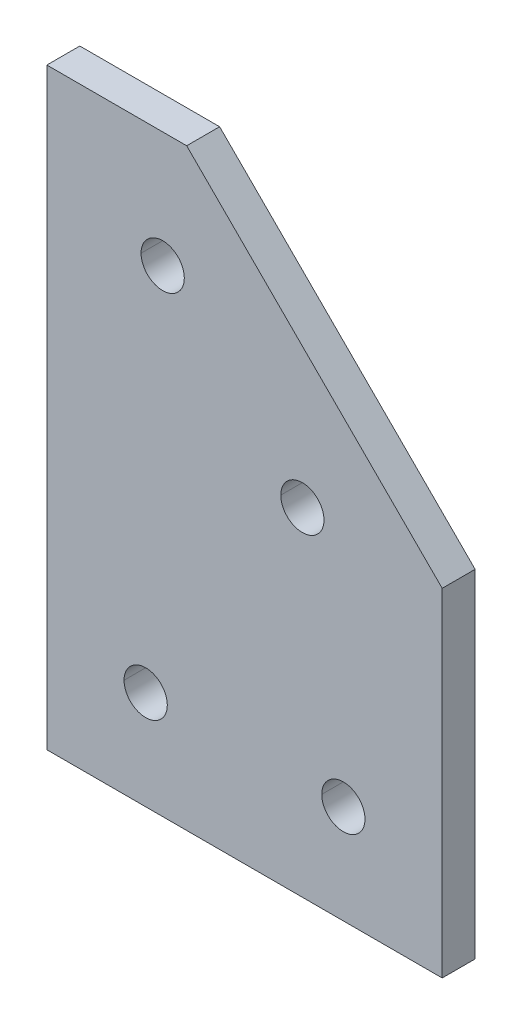
ISO-10303-21;
HEADER;
FILE_DESCRIPTION(('STEP AP214'),'2;1');
FILE_NAME('part.step','',(''),(''),'','','');
FILE_SCHEMA(('AUTOMOTIVE_DESIGN { 1 0 10303 214 1 1 1 1 }'));
ENDSEC;
DATA;
#1=APPLICATION_CONTEXT('core data for automotive mechanical design processes');
#2=APPLICATION_PROTOCOL_DEFINITION('international standard','automotive_design',2000,#1);
#3=PRODUCT_CONTEXT('',#1,'mechanical');
#4=PRODUCT('Part','Part','',(#3));
#5=PRODUCT_RELATED_PRODUCT_CATEGORY('part','',(#4));
#6=PRODUCT_DEFINITION_FORMATION('','',#4);
#7=PRODUCT_DEFINITION_CONTEXT('part definition',#1,'design');
#8=PRODUCT_DEFINITION('design','',#6,#7);
#9=PRODUCT_DEFINITION_SHAPE('','',#8);
#10=(LENGTH_UNIT() NAMED_UNIT(*) SI_UNIT(.MILLI.,.METRE.));
#11=(NAMED_UNIT(*) PLANE_ANGLE_UNIT() SI_UNIT($,.RADIAN.));
#12=(NAMED_UNIT(*) SI_UNIT($,.STERADIAN.) SOLID_ANGLE_UNIT());
#13=UNCERTAINTY_MEASURE_WITH_UNIT(LENGTH_MEASURE(1.E-05),#10,'distance_accuracy_value','');
#14=(GEOMETRIC_REPRESENTATION_CONTEXT(3) GLOBAL_UNCERTAINTY_ASSIGNED_CONTEXT((#13)) GLOBAL_UNIT_ASSIGNED_CONTEXT((#10,
#11,#12)) REPRESENTATION_CONTEXT('',''));
#15=CARTESIAN_POINT('',(0.,0.,0.));
#16=DIRECTION('',(0.,0.,1.));
#17=DIRECTION('',(1.,0.,0.));
#18=AXIS2_PLACEMENT_3D('',#15,#16,#17);
#19=CARTESIAN_POINT('',(-38.1,57.15,-3.175));
#20=DIRECTION('',(0.,-1.,0.));
#21=DIRECTION('',(0.,0.,1.));
#22=AXIS2_PLACEMENT_3D('',#19,#20,#21);
#23=PLANE('',#22);
#24=DIRECTION('',(1.,0.,0.));
#25=VECTOR('',#24,1.);
#26=CARTESIAN_POINT('',(-38.1,57.15,3.175));
#27=LINE('',#26,#25);
#28=CARTESIAN_POINT('',(-38.1,57.15,3.175));
#29=VERTEX_POINT('',#28);
#30=CARTESIAN_POINT('',(-11.1506,57.15,3.175));
#31=VERTEX_POINT('',#30);
#32=EDGE_CURVE('E12',#29,#31,#27,.T.);
#33=ORIENTED_EDGE('',*,*,#32,.T.);
#34=DIRECTION('',(0.,0.,1.));
#35=VECTOR('',#34,1.);
#36=CARTESIAN_POINT('',(-11.1506,57.15,-3.175));
#37=LINE('',#36,#35);
#38=CARTESIAN_POINT('',(-11.1506,57.15,-3.175));
#39=VERTEX_POINT('',#38);
#40=EDGE_CURVE('E32',#39,#31,#37,.T.);
#41=ORIENTED_EDGE('',*,*,#40,.F.);
#42=DIRECTION('',(1.,0.,0.));
#43=VECTOR('',#42,1.);
#44=CARTESIAN_POINT('',(-38.1,57.15,-3.175));
#45=LINE('',#44,#43);
#46=CARTESIAN_POINT('',(-38.1,57.15,-3.175));
#47=VERTEX_POINT('',#46);
#48=EDGE_CURVE('E316',#47,#39,#45,.T.);
#49=ORIENTED_EDGE('',*,*,#48,.F.);
#50=DIRECTION('',(0.,0.,1.));
#51=VECTOR('',#50,1.);
#52=CARTESIAN_POINT('',(-38.1,57.15,-3.175));
#53=LINE('',#52,#51);
#54=EDGE_CURVE('E312',#47,#29,#53,.T.);
#55=ORIENTED_EDGE('',*,*,#54,.T.);
#56=EDGE_LOOP('',(#33,#41,#49,#55));
#57=FACE_BOUND('',#56,.T.);
#58=ADVANCED_FACE('F24',(#57),#23,.F.);
#59=CARTESIAN_POINT('',(-38.1,-57.15,-3.175));
#60=DIRECTION('',(1.,0.,0.));
#61=DIRECTION('',(0.,0.,-1.));
#62=AXIS2_PLACEMENT_3D('',#59,#60,#61);
#63=PLANE('',#62);
#64=DIRECTION('',(0.,1.,0.));
#65=VECTOR('',#64,1.);
#66=CARTESIAN_POINT('',(-38.1,-57.15,3.175));
#67=LINE('',#66,#65);
#68=CARTESIAN_POINT('',(-38.1,-57.15,3.175));
#69=VERTEX_POINT('',#68);
#70=EDGE_CURVE('E307',#69,#29,#67,.T.);
#71=ORIENTED_EDGE('',*,*,#70,.T.);
#72=ORIENTED_EDGE('',*,*,#54,.F.);
#73=DIRECTION('',(0.,1.,0.));
#74=VECTOR('',#73,1.);
#75=CARTESIAN_POINT('',(-38.1,-57.15,-3.175));
#76=LINE('',#75,#74);
#77=CARTESIAN_POINT('',(-38.1,-57.15,-3.175));
#78=VERTEX_POINT('',#77);
#79=EDGE_CURVE('E302',#78,#47,#76,.T.);
#80=ORIENTED_EDGE('',*,*,#79,.F.);
#81=DIRECTION('',(0.,0.,1.));
#82=VECTOR('',#81,1.);
#83=CARTESIAN_POINT('',(-38.1,-57.15,-3.175));
#84=LINE('',#83,#82);
#85=EDGE_CURVE('E298',#78,#69,#84,.T.);
#86=ORIENTED_EDGE('',*,*,#85,.T.);
#87=EDGE_LOOP('',(#71,#72,#80,#86));
#88=FACE_BOUND('',#87,.T.);
#89=ADVANCED_FACE('F340',(#88),#63,.F.);
#90=CARTESIAN_POINT('',(38.1,-57.15,-3.175));
#91=DIRECTION('',(0.,1.,0.));
#92=DIRECTION('',(0.,0.,-1.));
#93=AXIS2_PLACEMENT_3D('',#90,#91,#92);
#94=PLANE('',#93);
#95=DIRECTION('',(-1.,0.,0.));
#96=VECTOR('',#95,1.);
#97=CARTESIAN_POINT('',(38.1,-57.15,3.175));
#98=LINE('',#97,#96);
#99=CARTESIAN_POINT('',(38.1,-57.15,3.175));
#100=VERTEX_POINT('',#99);
#101=EDGE_CURVE('E293',#100,#69,#98,.T.);
#102=ORIENTED_EDGE('',*,*,#101,.T.);
#103=ORIENTED_EDGE('',*,*,#85,.F.);
#104=DIRECTION('',(-1.,0.,0.));
#105=VECTOR('',#104,1.);
#106=CARTESIAN_POINT('',(38.1,-57.15,-3.175));
#107=LINE('',#106,#105);
#108=CARTESIAN_POINT('',(38.1,-57.15,-3.175));
#109=VERTEX_POINT('',#108);
#110=EDGE_CURVE('E288',#109,#78,#107,.T.);
#111=ORIENTED_EDGE('',*,*,#110,.F.);
#112=DIRECTION('',(0.,0.,1.));
#113=VECTOR('',#112,1.);
#114=CARTESIAN_POINT('',(38.1,-57.15,-3.175));
#115=LINE('',#114,#113);
#116=EDGE_CURVE('E284',#109,#100,#115,.T.);
#117=ORIENTED_EDGE('',*,*,#116,.T.);
#118=EDGE_LOOP('',(#102,#103,#111,#117));
#119=FACE_BOUND('',#118,.T.);
#120=ADVANCED_FACE('F343',(#119),#94,.F.);
#121=CARTESIAN_POINT('',(38.1,7.89939999999999,-3.175));
#122=DIRECTION('',(-1.,0.,0.));
#123=DIRECTION('',(0.,0.,1.));
#124=AXIS2_PLACEMENT_3D('',#121,#122,#123);
#125=PLANE('',#124);
#126=DIRECTION('',(0.,-1.,0.));
#127=VECTOR('',#126,1.);
#128=CARTESIAN_POINT('',(38.1,7.89939999999999,3.175));
#129=LINE('',#128,#127);
#130=CARTESIAN_POINT('',(38.1,7.89939999999999,3.175));
#131=VERTEX_POINT('',#130);
#132=EDGE_CURVE('E279',#131,#100,#129,.T.);
#133=ORIENTED_EDGE('',*,*,#132,.T.);
#134=ORIENTED_EDGE('',*,*,#116,.F.);
#135=DIRECTION('',(0.,-1.,0.));
#136=VECTOR('',#135,1.);
#137=CARTESIAN_POINT('',(38.1,7.89939999999999,-3.175));
#138=LINE('',#137,#136);
#139=CARTESIAN_POINT('',(38.1,7.89939999999999,-3.175));
#140=VERTEX_POINT('',#139);
#141=EDGE_CURVE('E274',#140,#109,#138,.T.);
#142=ORIENTED_EDGE('',*,*,#141,.F.);
#143=DIRECTION('',(0.,0.,1.));
#144=VECTOR('',#143,1.);
#145=CARTESIAN_POINT('',(38.1,7.89939999999999,-3.175));
#146=LINE('',#145,#144);
#147=EDGE_CURVE('E270',#140,#131,#146,.T.);
#148=ORIENTED_EDGE('',*,*,#147,.T.);
#149=EDGE_LOOP('',(#133,#134,#142,#148));
#150=FACE_BOUND('',#149,.T.);
#151=ADVANCED_FACE('F335',(#150),#125,.F.);
#152=CARTESIAN_POINT('',(-11.1506,57.15,-3.175));
#153=DIRECTION('',(-0.707106781186547,-0.707106781186548,0.));
#154=DIRECTION('',(-0.707106781186548,0.707106781186547,0.));
#155=AXIS2_PLACEMENT_3D('',#152,#153,#154);
#156=PLANE('',#155);
#157=DIRECTION('',(0.707106781186548,-0.707106781186547,0.));
#158=VECTOR('',#157,1.);
#159=CARTESIAN_POINT('',(-11.1506,57.15,3.175));
#160=LINE('',#159,#158);
#161=EDGE_CURVE('E265',#31,#131,#160,.T.);
#162=ORIENTED_EDGE('',*,*,#161,.T.);
#163=ORIENTED_EDGE('',*,*,#147,.F.);
#164=DIRECTION('',(0.707106781186548,-0.707106781186547,0.));
#165=VECTOR('',#164,1.);
#166=CARTESIAN_POINT('',(-11.1506,57.15,-3.175));
#167=LINE('',#166,#165);
#168=EDGE_CURVE('E260',#39,#140,#167,.T.);
#169=ORIENTED_EDGE('',*,*,#168,.F.);
#170=ORIENTED_EDGE('',*,*,#40,.T.);
#171=EDGE_LOOP('',(#162,#163,#169,#170));
#172=FACE_BOUND('',#171,.T.);
#173=ADVANCED_FACE('F327',(#172),#156,.F.);
#174=CARTESIAN_POINT('',(0.,-57.15,-3.175));
#175=DIRECTION('',(0.,0.,-1.));
#176=DIRECTION('',(-1.,0.,0.));
#177=AXIS2_PLACEMENT_3D('',#174,#175,#176);
#178=PLANE('',#177);
#179=CARTESIAN_POINT('',(19.05,-38.1,-3.175));
#180=DIRECTION('',(0.,0.,-1.));
#181=DIRECTION('',(-1.,0.,0.));
#182=AXIS2_PLACEMENT_3D('',#179,#180,#181);
#183=CIRCLE('',#182,4.1656);
#184=CARTESIAN_POINT('',(14.8844,-38.1,-3.175));
#185=VERTEX_POINT('',#184);
#186=CARTESIAN_POINT('',(23.2156,-38.1,-3.175));
#187=VERTEX_POINT('',#186);
#188=EDGE_CURVE('E255',#185,#187,#183,.T.);
#189=ORIENTED_EDGE('',*,*,#188,.F.);
#190=CARTESIAN_POINT('',(19.05,-38.1,-3.175));
#191=DIRECTION('',(0.,0.,-1.));
#192=DIRECTION('',(-1.,0.,0.));
#193=AXIS2_PLACEMENT_3D('',#190,#191,#192);
#194=CIRCLE('',#193,4.1656);
#195=EDGE_CURVE('E250',#187,#185,#194,.T.);
#196=ORIENTED_EDGE('',*,*,#195,.F.);
#197=EDGE_LOOP('',(#189,#196));
#198=FACE_BOUND('',#197,.T.);
#199=CARTESIAN_POINT('',(11.1506,7.89939999999999,-3.175));
#200=DIRECTION('',(0.,0.,-1.));
#201=DIRECTION('',(-1.,0.,0.));
#202=AXIS2_PLACEMENT_3D('',#199,#200,#201);
#203=CIRCLE('',#202,4.1656);
#204=CARTESIAN_POINT('',(6.98499999999999,7.89939999999999,-3.175));
#205=VERTEX_POINT('',#204);
#206=CARTESIAN_POINT('',(15.3162,7.89939999999999,-3.175));
#207=VERTEX_POINT('',#206);
#208=EDGE_CURVE('E245',#205,#207,#203,.T.);
#209=ORIENTED_EDGE('',*,*,#208,.F.);
#210=CARTESIAN_POINT('',(11.1506,7.89939999999999,-3.175));
#211=DIRECTION('',(0.,0.,-1.));
#212=DIRECTION('',(-1.,0.,0.));
#213=AXIS2_PLACEMENT_3D('',#210,#211,#212);
#214=CIRCLE('',#213,4.1656);
#215=EDGE_CURVE('E240',#207,#205,#214,.T.);
#216=ORIENTED_EDGE('',*,*,#215,.F.);
#217=EDGE_LOOP('',(#209,#216));
#218=FACE_BOUND('',#217,.T.);
#219=CARTESIAN_POINT('',(-15.7734,34.8234,-3.175));
#220=DIRECTION('',(0.,0.,-1.));
#221=DIRECTION('',(-1.,0.,0.));
#222=AXIS2_PLACEMENT_3D('',#219,#220,#221);
#223=CIRCLE('',#222,4.1656);
#224=CARTESIAN_POINT('',(-19.939,34.8234,-3.175));
#225=VERTEX_POINT('',#224);
#226=CARTESIAN_POINT('',(-11.6078,34.8234,-3.175));
#227=VERTEX_POINT('',#226);
#228=EDGE_CURVE('E236',#225,#227,#223,.T.);
#229=ORIENTED_EDGE('',*,*,#228,.F.);
#230=CARTESIAN_POINT('',(-15.7734,34.8234,-3.175));
#231=DIRECTION('',(0.,0.,-1.));
#232=DIRECTION('',(-1.,0.,0.));
#233=AXIS2_PLACEMENT_3D('',#230,#231,#232);
#234=CIRCLE('',#233,4.1656);
#235=EDGE_CURVE('E129',#227,#225,#234,.T.);
#236=ORIENTED_EDGE('',*,*,#235,.F.);
#237=EDGE_LOOP('',(#229,#236));
#238=FACE_BOUND('',#237,.T.);
#239=CARTESIAN_POINT('',(-19.05,-38.1,-3.175));
#240=DIRECTION('',(0.,0.,-1.));
#241=DIRECTION('',(-1.,0.,0.));
#242=AXIS2_PLACEMENT_3D('',#239,#240,#241);
#243=CIRCLE('',#242,4.1656);
#244=CARTESIAN_POINT('',(-23.2156,-38.1,-3.175));
#245=VERTEX_POINT('',#244);
#246=CARTESIAN_POINT('',(-14.8844,-38.1,-3.175));
#247=VERTEX_POINT('',#246);
#248=EDGE_CURVE('E229',#245,#247,#243,.T.);
#249=ORIENTED_EDGE('',*,*,#248,.F.);
#250=CARTESIAN_POINT('',(-19.05,-38.1,-3.175));
#251=DIRECTION('',(0.,0.,-1.));
#252=DIRECTION('',(-1.,0.,0.));
#253=AXIS2_PLACEMENT_3D('',#250,#251,#252);
#254=CIRCLE('',#253,4.1656);
#255=EDGE_CURVE('E225',#247,#245,#254,.T.);
#256=ORIENTED_EDGE('',*,*,#255,.F.);
#257=EDGE_LOOP('',(#249,#256));
#258=FACE_BOUND('',#257,.T.);
#259=ORIENTED_EDGE('',*,*,#168,.T.);
#260=ORIENTED_EDGE('',*,*,#141,.T.);
#261=ORIENTED_EDGE('',*,*,#110,.T.);
#262=ORIENTED_EDGE('',*,*,#79,.T.);
#263=ORIENTED_EDGE('',*,*,#48,.T.);
#264=EDGE_LOOP('',(#259,#260,#261,#262,#263));
#265=FACE_BOUND('',#264,.T.);
#266=ADVANCED_FACE('F337',(#198,#218,#238,#258,#265),#178,.T.);
#267=CARTESIAN_POINT('',(-19.05,-38.1,-3.175));
#268=DIRECTION('',(0.,0.,-1.));
#269=DIRECTION('',(0.,1.,0.));
#270=AXIS2_PLACEMENT_3D('',#267,#268,#269);
#271=CYLINDRICAL_SURFACE('',#270,4.1656);
#272=CARTESIAN_POINT('',(-19.05,-38.1,3.175));
#273=DIRECTION('',(0.,0.,-1.));
#274=DIRECTION('',(-1.,0.,0.));
#275=AXIS2_PLACEMENT_3D('',#272,#273,#274);
#276=CIRCLE('',#275,4.1656);
#277=CARTESIAN_POINT('',(-14.8844,-38.1,3.175));
#278=VERTEX_POINT('',#277);
#279=CARTESIAN_POINT('',(-23.2156,-38.1,3.175));
#280=VERTEX_POINT('',#279);
#281=EDGE_CURVE('E222',#278,#280,#276,.T.);
#282=ORIENTED_EDGE('',*,*,#281,.F.);
#283=CARTESIAN_POINT('',(-14.8844,-38.1,3.175));
#284=DIRECTION('',(0.,0.,-1.));
#285=VECTOR('',#284,1.);
#286=LINE('',#283,#285);
#287=EDGE_CURVE('E199',#278,#247,#286,.T.);
#288=ORIENTED_EDGE('',*,*,#287,.T.);
#289=ORIENTED_EDGE('',*,*,#255,.T.);
#290=CARTESIAN_POINT('',(-23.2156,-38.1,3.175));
#291=DIRECTION('',(0.,0.,-1.));
#292=VECTOR('',#291,1.);
#293=LINE('',#290,#292);
#294=EDGE_CURVE('E212',#280,#245,#293,.T.);
#295=ORIENTED_EDGE('',*,*,#294,.F.);
#296=EDGE_LOOP('',(#282,#288,#289,#295));
#297=FACE_BOUND('',#296,.T.);
#298=ADVANCED_FACE('F177',(#297),#271,.F.);
#299=CARTESIAN_POINT('',(-19.05,-38.1,-3.175));
#300=DIRECTION('',(0.,0.,-1.));
#301=DIRECTION('',(0.,-1.,0.));
#302=AXIS2_PLACEMENT_3D('',#299,#300,#301);
#303=CYLINDRICAL_SURFACE('',#302,4.1656);
#304=ORIENTED_EDGE('',*,*,#248,.T.);
#305=ORIENTED_EDGE('',*,*,#287,.F.);
#306=CARTESIAN_POINT('',(-19.05,-38.1,3.175));
#307=DIRECTION('',(0.,0.,-1.));
#308=DIRECTION('',(-1.,0.,0.));
#309=AXIS2_PLACEMENT_3D('',#306,#307,#308);
#310=CIRCLE('',#309,4.1656);
#311=EDGE_CURVE('E158',#280,#278,#310,.T.);
#312=ORIENTED_EDGE('',*,*,#311,.F.);
#313=ORIENTED_EDGE('',*,*,#294,.T.);
#314=EDGE_LOOP('',(#304,#305,#312,#313));
#315=FACE_BOUND('',#314,.T.);
#316=ADVANCED_FACE('F167',(#315),#303,.F.);
#317=CARTESIAN_POINT('',(0.,-57.15,3.175));
#318=DIRECTION('',(0.,0.,-1.));
#319=DIRECTION('',(-1.,0.,0.));
#320=AXIS2_PLACEMENT_3D('',#317,#318,#319);
#321=PLANE('',#320);
#322=CARTESIAN_POINT('',(19.05,-38.1,3.175));
#323=DIRECTION('',(0.,0.,-1.));
#324=DIRECTION('',(-1.,0.,0.));
#325=AXIS2_PLACEMENT_3D('',#322,#323,#324);
#326=CIRCLE('',#325,4.1656);
#327=CARTESIAN_POINT('',(14.8844,-38.1,3.175));
#328=VERTEX_POINT('',#327);
#329=CARTESIAN_POINT('',(23.2156,-38.1,3.175));
#330=VERTEX_POINT('',#329);
#331=EDGE_CURVE('E154',#328,#330,#326,.T.);
#332=ORIENTED_EDGE('',*,*,#331,.T.);
#333=CARTESIAN_POINT('',(19.05,-38.1,3.175));
#334=DIRECTION('',(0.,0.,-1.));
#335=DIRECTION('',(-1.,0.,0.));
#336=AXIS2_PLACEMENT_3D('',#333,#334,#335);
#337=CIRCLE('',#336,4.1656);
#338=EDGE_CURVE('E150',#330,#328,#337,.T.);
#339=ORIENTED_EDGE('',*,*,#338,.T.);
#340=EDGE_LOOP('',(#332,#339));
#341=FACE_BOUND('',#340,.T.);
#342=CARTESIAN_POINT('',(11.1506,7.89939999999999,3.175));
#343=DIRECTION('',(0.,0.,-1.));
#344=DIRECTION('',(-1.,0.,0.));
#345=AXIS2_PLACEMENT_3D('',#342,#343,#344);
#346=CIRCLE('',#345,4.1656);
#347=CARTESIAN_POINT('',(6.98499999999999,7.89939999999999,3.175));
#348=VERTEX_POINT('',#347);
#349=CARTESIAN_POINT('',(15.3162,7.89939999999999,3.175));
#350=VERTEX_POINT('',#349);
#351=EDGE_CURVE('E140',#348,#350,#346,.T.);
#352=ORIENTED_EDGE('',*,*,#351,.T.);
#353=CARTESIAN_POINT('',(11.1506,7.89939999999999,3.175));
#354=DIRECTION('',(0.,0.,-1.));
#355=DIRECTION('',(-1.,0.,0.));
#356=AXIS2_PLACEMENT_3D('',#353,#354,#355);
#357=CIRCLE('',#356,4.1656);
#358=EDGE_CURVE('E138',#350,#348,#357,.T.);
#359=ORIENTED_EDGE('',*,*,#358,.T.);
#360=EDGE_LOOP('',(#352,#359));
#361=FACE_BOUND('',#360,.T.);
#362=CARTESIAN_POINT('',(-15.7734,34.8234,3.175));
#363=DIRECTION('',(0.,0.,-1.));
#364=DIRECTION('',(-1.,0.,0.));
#365=AXIS2_PLACEMENT_3D('',#362,#363,#364);
#366=CIRCLE('',#365,4.1656);
#367=CARTESIAN_POINT('',(-19.939,34.8234,3.175));
#368=VERTEX_POINT('',#367);
#369=CARTESIAN_POINT('',(-11.6078,34.8234,3.175));
#370=VERTEX_POINT('',#369);
#371=EDGE_CURVE('E118',#368,#370,#366,.T.);
#372=ORIENTED_EDGE('',*,*,#371,.T.);
#373=CARTESIAN_POINT('',(-15.7734,34.8234,3.175));
#374=DIRECTION('',(0.,0.,-1.));
#375=DIRECTION('',(-1.,0.,0.));
#376=AXIS2_PLACEMENT_3D('',#373,#374,#375);
#377=CIRCLE('',#376,4.1656);
#378=EDGE_CURVE('E113',#370,#368,#377,.T.);
#379=ORIENTED_EDGE('',*,*,#378,.T.);
#380=EDGE_LOOP('',(#372,#379));
#381=FACE_BOUND('',#380,.T.);
#382=ORIENTED_EDGE('',*,*,#311,.T.);
#383=ORIENTED_EDGE('',*,*,#281,.T.);
#384=EDGE_LOOP('',(#382,#383));
#385=FACE_BOUND('',#384,.T.);
#386=ORIENTED_EDGE('',*,*,#161,.F.);
#387=ORIENTED_EDGE('',*,*,#32,.F.);
#388=ORIENTED_EDGE('',*,*,#70,.F.);
#389=ORIENTED_EDGE('',*,*,#101,.F.);
#390=ORIENTED_EDGE('',*,*,#132,.F.);
#391=EDGE_LOOP('',(#386,#387,#388,#389,#390));
#392=FACE_BOUND('',#391,.T.);
#393=ADVANCED_FACE('F115',(#341,#361,#381,#385,#392),#321,.F.);
#394=CARTESIAN_POINT('',(-15.7734,34.8234,-3.175));
#395=DIRECTION('',(0.,0.,-1.));
#396=DIRECTION('',(0.,1.,0.));
#397=AXIS2_PLACEMENT_3D('',#394,#395,#396);
#398=CYLINDRICAL_SURFACE('',#397,4.1656);
#399=ORIENTED_EDGE('',*,*,#378,.F.);
#400=CARTESIAN_POINT('',(-11.6078,34.8234,3.175));
#401=DIRECTION('',(0.,0.,-1.));
#402=VECTOR('',#401,1.);
#403=LINE('',#400,#402);
#404=EDGE_CURVE('E122',#370,#227,#403,.T.);
#405=ORIENTED_EDGE('',*,*,#404,.T.);
#406=ORIENTED_EDGE('',*,*,#235,.T.);
#407=CARTESIAN_POINT('',(-19.939,34.8234,3.175));
#408=DIRECTION('',(0.,0.,-1.));
#409=VECTOR('',#408,1.);
#410=LINE('',#407,#409);
#411=EDGE_CURVE('E126',#368,#225,#410,.T.);
#412=ORIENTED_EDGE('',*,*,#411,.F.);
#413=EDGE_LOOP('',(#399,#405,#406,#412));
#414=FACE_BOUND('',#413,.T.);
#415=ADVANCED_FACE('F128',(#414),#398,.F.);
#416=CARTESIAN_POINT('',(-15.7734,34.8234,-3.175));
#417=DIRECTION('',(0.,0.,-1.));
#418=DIRECTION('',(0.,-1.,0.));
#419=AXIS2_PLACEMENT_3D('',#416,#417,#418);
#420=CYLINDRICAL_SURFACE('',#419,4.1656);
#421=ORIENTED_EDGE('',*,*,#228,.T.);
#422=ORIENTED_EDGE('',*,*,#404,.F.);
#423=ORIENTED_EDGE('',*,*,#371,.F.);
#424=ORIENTED_EDGE('',*,*,#411,.T.);
#425=EDGE_LOOP('',(#421,#422,#423,#424));
#426=FACE_BOUND('',#425,.T.);
#427=ADVANCED_FACE('F136',(#426),#420,.F.);
#428=CARTESIAN_POINT('',(11.1506,7.89939999999999,-3.175));
#429=DIRECTION('',(0.,0.,-1.));
#430=DIRECTION('',(0.,1.,0.));
#431=AXIS2_PLACEMENT_3D('',#428,#429,#430);
#432=CYLINDRICAL_SURFACE('',#431,4.1656);
#433=ORIENTED_EDGE('',*,*,#358,.F.);
#434=CARTESIAN_POINT('',(15.3162,7.89939999999999,3.175));
#435=DIRECTION('',(0.,0.,-1.));
#436=VECTOR('',#435,1.);
#437=LINE('',#434,#436);
#438=EDGE_CURVE('E133',#350,#207,#437,.T.);
#439=ORIENTED_EDGE('',*,*,#438,.T.);
#440=ORIENTED_EDGE('',*,*,#215,.T.);
#441=CARTESIAN_POINT('',(6.98499999999999,7.89939999999999,3.175));
#442=DIRECTION('',(0.,0.,-1.));
#443=VECTOR('',#442,1.);
#444=LINE('',#441,#443);
#445=EDGE_CURVE('E522',#348,#205,#444,.T.);
#446=ORIENTED_EDGE('',*,*,#445,.F.);
#447=EDGE_LOOP('',(#433,#439,#440,#446));
#448=FACE_BOUND('',#447,.T.);
#449=ADVANCED_FACE('F454',(#448),#432,.F.);
#450=CARTESIAN_POINT('',(11.1506,7.89939999999999,-3.175));
#451=DIRECTION('',(0.,0.,-1.));
#452=DIRECTION('',(0.,-1.,0.));
#453=AXIS2_PLACEMENT_3D('',#450,#451,#452);
#454=CYLINDRICAL_SURFACE('',#453,4.1656);
#455=ORIENTED_EDGE('',*,*,#208,.T.);
#456=ORIENTED_EDGE('',*,*,#438,.F.);
#457=ORIENTED_EDGE('',*,*,#351,.F.);
#458=ORIENTED_EDGE('',*,*,#445,.T.);
#459=EDGE_LOOP('',(#455,#456,#457,#458));
#460=FACE_BOUND('',#459,.T.);
#461=ADVANCED_FACE('F465',(#460),#454,.F.);
#462=CARTESIAN_POINT('',(19.05,-38.1,-3.175));
#463=DIRECTION('',(0.,0.,-1.));
#464=DIRECTION('',(0.,1.,0.));
#465=AXIS2_PLACEMENT_3D('',#462,#463,#464);
#466=CYLINDRICAL_SURFACE('',#465,4.1656);
#467=ORIENTED_EDGE('',*,*,#338,.F.);
#468=CARTESIAN_POINT('',(23.2156,-38.1,3.175));
#469=DIRECTION('',(0.,0.,-1.));
#470=VECTOR('',#469,1.);
#471=LINE('',#468,#470);
#472=EDGE_CURVE('E520',#330,#187,#471,.T.);
#473=ORIENTED_EDGE('',*,*,#472,.T.);
#474=ORIENTED_EDGE('',*,*,#195,.T.);
#475=CARTESIAN_POINT('',(14.8844,-38.1,3.175));
#476=DIRECTION('',(0.,0.,-1.));
#477=VECTOR('',#476,1.);
#478=LINE('',#475,#477);
#479=EDGE_CURVE('E516',#328,#185,#478,.T.);
#480=ORIENTED_EDGE('',*,*,#479,.F.);
#481=EDGE_LOOP('',(#467,#473,#474,#480));
#482=FACE_BOUND('',#481,.T.);
#483=ADVANCED_FACE('F476',(#482),#466,.F.);
#484=CARTESIAN_POINT('',(19.05,-38.1,-3.175));
#485=DIRECTION('',(0.,0.,-1.));
#486=DIRECTION('',(0.,-1.,0.));
#487=AXIS2_PLACEMENT_3D('',#484,#485,#486);
#488=CYLINDRICAL_SURFACE('',#487,4.1656);
#489=ORIENTED_EDGE('',*,*,#188,.T.);
#490=ORIENTED_EDGE('',*,*,#472,.F.);
#491=ORIENTED_EDGE('',*,*,#331,.F.);
#492=ORIENTED_EDGE('',*,*,#479,.T.);
#493=EDGE_LOOP('',(#489,#490,#491,#492));
#494=FACE_BOUND('',#493,.T.);
#495=ADVANCED_FACE('F365',(#494),#488,.F.);
#496=CLOSED_SHELL('',(#58,#89,#120,#151,#173,#266,#298,#316,#393,#415,#427,#449,#461,#483,#495));
#497=MANIFOLD_SOLID_BREP('B1',#496);
#498=ADVANCED_BREP_SHAPE_REPRESENTATION('',(#18,#497),#14);
#499=SHAPE_DEFINITION_REPRESENTATION(#9,#498);
ENDSEC;
END-ISO-10303-21;
